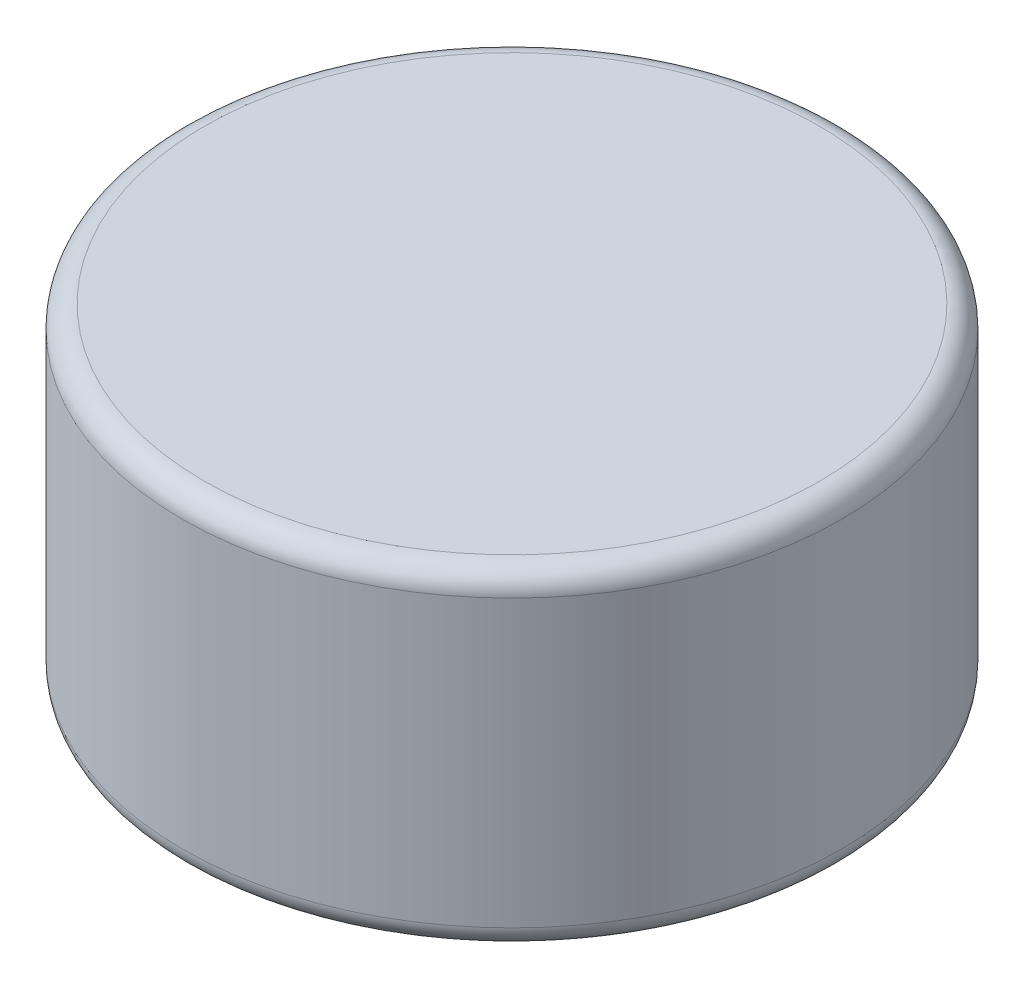
ISO-10303-21;
HEADER;
FILE_DESCRIPTION(('STEP AP214'),'2;1');
FILE_NAME('part.step','',(''),(''),'','','');
FILE_SCHEMA(('AUTOMOTIVE_DESIGN { 1 0 10303 214 1 1 1 1 }'));
ENDSEC;
DATA;
#1=APPLICATION_CONTEXT('core data for automotive mechanical design processes');
#2=APPLICATION_PROTOCOL_DEFINITION('international standard','automotive_design',2000,#1);
#3=PRODUCT_CONTEXT('',#1,'mechanical');
#4=PRODUCT('Part','Part','',(#3));
#5=PRODUCT_RELATED_PRODUCT_CATEGORY('part','',(#4));
#6=PRODUCT_DEFINITION_FORMATION('','',#4);
#7=PRODUCT_DEFINITION_CONTEXT('part definition',#1,'design');
#8=PRODUCT_DEFINITION('design','',#6,#7);
#9=PRODUCT_DEFINITION_SHAPE('','',#8);
#10=(LENGTH_UNIT() NAMED_UNIT(*) SI_UNIT(.MILLI.,.METRE.));
#11=(NAMED_UNIT(*) PLANE_ANGLE_UNIT() SI_UNIT($,.RADIAN.));
#12=(NAMED_UNIT(*) SI_UNIT($,.STERADIAN.) SOLID_ANGLE_UNIT());
#13=UNCERTAINTY_MEASURE_WITH_UNIT(LENGTH_MEASURE(1.E-05),#10,'distance_accuracy_value','');
#14=(GEOMETRIC_REPRESENTATION_CONTEXT(3) GLOBAL_UNCERTAINTY_ASSIGNED_CONTEXT((#13)) GLOBAL_UNIT_ASSIGNED_CONTEXT((#10,
#11,#12)) REPRESENTATION_CONTEXT('',''));
#15=CARTESIAN_POINT('',(0.,0.,0.));
#16=DIRECTION('',(0.,0.,1.));
#17=DIRECTION('',(1.,0.,0.));
#18=AXIS2_PLACEMENT_3D('',#15,#16,#17);
#19=CARTESIAN_POINT('',(0.,15.,0.));
#20=DIRECTION('',(0.,-1.,0.));
#21=DIRECTION('',(0.,0.,-1.));
#22=AXIS2_PLACEMENT_3D('',#19,#20,#21);
#23=CYLINDRICAL_SURFACE('',#22,15.);
#24=CARTESIAN_POINT('',(0.,14.,0.));
#25=DIRECTION('',(0.,1.,0.));
#26=DIRECTION('',(0.,0.,1.));
#27=AXIS2_PLACEMENT_3D('',#24,#25,#26);
#28=CIRCLE('',#27,15.);
#29=CARTESIAN_POINT('',(0.,14.,15.));
#30=VERTEX_POINT('',#29);
#31=EDGE_CURVE('E44',#30,#30,#28,.F.);
#32=ORIENTED_EDGE('',*,*,#31,.T.);
#33=EDGE_LOOP('',(#32));
#34=FACE_BOUND('',#33,.T.);
#35=CARTESIAN_POINT('',(0.,1.,0.));
#36=DIRECTION('',(0.,1.,0.));
#37=DIRECTION('',(0.,0.,1.));
#38=AXIS2_PLACEMENT_3D('',#35,#36,#37);
#39=CIRCLE('',#38,15.);
#40=CARTESIAN_POINT('',(0.,1.,15.));
#41=VERTEX_POINT('',#40);
#42=EDGE_CURVE('E48',#41,#41,#39,.T.);
#43=ORIENTED_EDGE('',*,*,#42,.T.);
#44=EDGE_LOOP('',(#43));
#45=FACE_BOUND('',#44,.T.);
#46=ADVANCED_FACE('F37',(#34,#45),#23,.T.);
#47=CARTESIAN_POINT('',(0.,15.,0.));
#48=DIRECTION('',(0.,1.,0.));
#49=DIRECTION('',(0.,0.,1.));
#50=AXIS2_PLACEMENT_3D('',#47,#48,#49);
#51=PLANE('',#50);
#52=CARTESIAN_POINT('',(0.,15.,0.));
#53=DIRECTION('',(0.,1.,0.));
#54=DIRECTION('',(0.,0.,1.));
#55=AXIS2_PLACEMENT_3D('',#52,#53,#54);
#56=CIRCLE('',#55,14.);
#57=CARTESIAN_POINT('',(0.,15.,14.));
#58=VERTEX_POINT('',#57);
#59=EDGE_CURVE('E52',#58,#58,#56,.T.);
#60=ORIENTED_EDGE('',*,*,#59,.T.);
#61=EDGE_LOOP('',(#60));
#62=FACE_BOUND('',#61,.T.);
#63=ADVANCED_FACE('F58',(#62),#51,.T.);
#64=CARTESIAN_POINT('',(0.,0.,0.));
#65=DIRECTION('',(0.,1.,0.));
#66=DIRECTION('',(0.,0.,1.));
#67=AXIS2_PLACEMENT_3D('',#64,#65,#66);
#68=PLANE('',#67);
#69=CARTESIAN_POINT('',(0.,0.,0.));
#70=DIRECTION('',(0.,1.,0.));
#71=DIRECTION('',(0.,0.,1.));
#72=AXIS2_PLACEMENT_3D('',#69,#70,#71);
#73=CIRCLE('',#72,14.);
#74=CARTESIAN_POINT('',(0.,0.,14.));
#75=VERTEX_POINT('',#74);
#76=EDGE_CURVE('E10',#75,#75,#73,.F.);
#77=ORIENTED_EDGE('',*,*,#76,.T.);
#78=EDGE_LOOP('',(#77));
#79=FACE_BOUND('',#78,.T.);
#80=ADVANCED_FACE('F62',(#79),#68,.F.);
#81=CARTESIAN_POINT('',(0.,14.,0.));
#82=DIRECTION('',(0.,1.,0.));
#83=DIRECTION('',(0.,0.,1.));
#84=AXIS2_PLACEMENT_3D('',#81,#82,#83);
#85=TOROIDAL_SURFACE('',#84,14.,1.);
#86=ORIENTED_EDGE('',*,*,#31,.F.);
#87=EDGE_LOOP('',(#86));
#88=FACE_BOUND('',#87,.T.);
#89=ORIENTED_EDGE('',*,*,#59,.F.);
#90=EDGE_LOOP('',(#89));
#91=FACE_BOUND('',#90,.T.);
#92=ADVANCED_FACE('F60',(#88,#91),#85,.T.);
#93=CARTESIAN_POINT('',(0.,1.,0.));
#94=DIRECTION('',(0.,1.,0.));
#95=DIRECTION('',(0.,0.,1.));
#96=AXIS2_PLACEMENT_3D('',#93,#94,#95);
#97=TOROIDAL_SURFACE('',#96,14.,1.);
#98=ORIENTED_EDGE('',*,*,#76,.F.);
#99=EDGE_LOOP('',(#98));
#100=FACE_BOUND('',#99,.T.);
#101=ORIENTED_EDGE('',*,*,#42,.F.);
#102=EDGE_LOOP('',(#101));
#103=FACE_BOUND('',#102,.T.);
#104=ADVANCED_FACE('F39',(#100,#103),#97,.T.);
#105=CLOSED_SHELL('',(#46,#63,#80,#92,#104));
#106=MANIFOLD_SOLID_BREP('B2',#105);
#107=ADVANCED_BREP_SHAPE_REPRESENTATION('',(#18,#106),#14);
#108=SHAPE_DEFINITION_REPRESENTATION(#9,#107);
ENDSEC;
END-ISO-10303-21;
